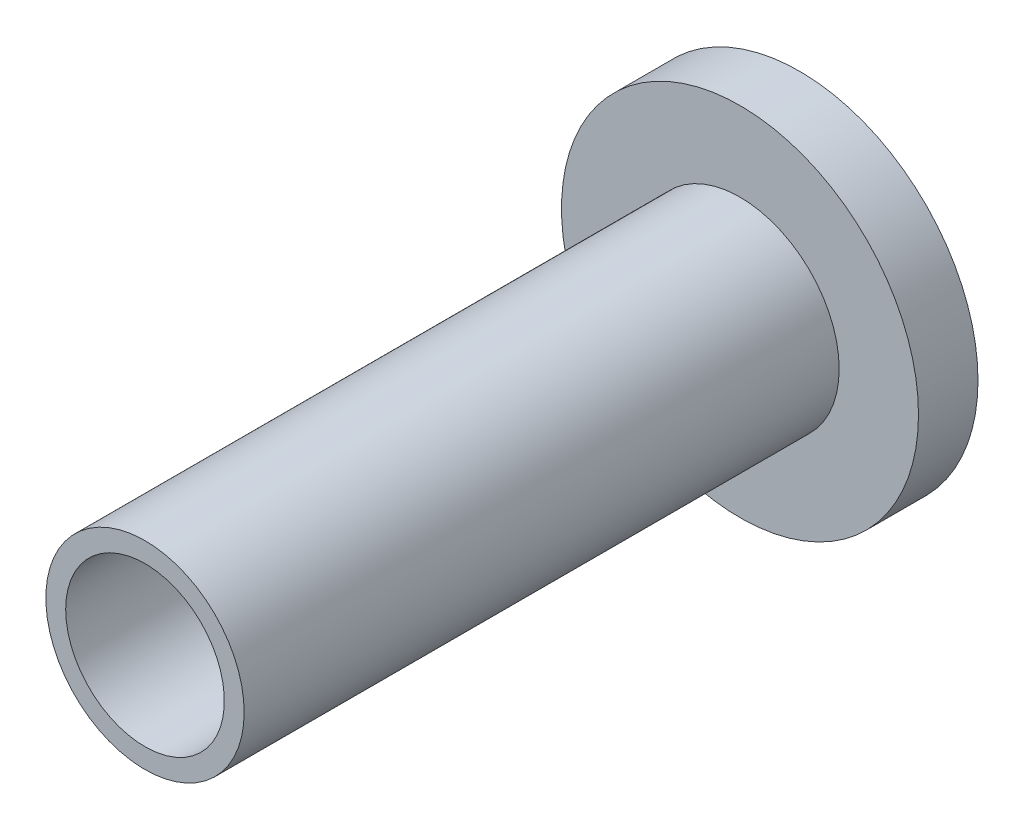
ISO-10303-21;
HEADER;
FILE_DESCRIPTION(('STEP AP214'),'2;1');
FILE_NAME('part.step','',(''),(''),'','','');
FILE_SCHEMA(('AUTOMOTIVE_DESIGN { 1 0 10303 214 1 1 1 1 }'));
ENDSEC;
DATA;
#1=APPLICATION_CONTEXT('core data for automotive mechanical design processes');
#2=APPLICATION_PROTOCOL_DEFINITION('international standard','automotive_design',2000,#1);
#3=PRODUCT_CONTEXT('',#1,'mechanical');
#4=PRODUCT('Part','Part','',(#3));
#5=PRODUCT_RELATED_PRODUCT_CATEGORY('part','',(#4));
#6=PRODUCT_DEFINITION_FORMATION('','',#4);
#7=PRODUCT_DEFINITION_CONTEXT('part definition',#1,'design');
#8=PRODUCT_DEFINITION('design','',#6,#7);
#9=PRODUCT_DEFINITION_SHAPE('','',#8);
#10=(LENGTH_UNIT() NAMED_UNIT(*) SI_UNIT(.MILLI.,.METRE.));
#11=(NAMED_UNIT(*) PLANE_ANGLE_UNIT() SI_UNIT($,.RADIAN.));
#12=(NAMED_UNIT(*) SI_UNIT($,.STERADIAN.) SOLID_ANGLE_UNIT());
#13=UNCERTAINTY_MEASURE_WITH_UNIT(LENGTH_MEASURE(1.E-05),#10,'distance_accuracy_value','');
#14=(GEOMETRIC_REPRESENTATION_CONTEXT(3) GLOBAL_UNCERTAINTY_ASSIGNED_CONTEXT((#13)) GLOBAL_UNIT_ASSIGNED_CONTEXT((#10,
#11,#12)) REPRESENTATION_CONTEXT('',''));
#15=CARTESIAN_POINT('',(0.,0.,0.));
#16=DIRECTION('',(0.,0.,1.));
#17=DIRECTION('',(1.,0.,0.));
#18=AXIS2_PLACEMENT_3D('',#15,#16,#17);
#19=CARTESIAN_POINT('',(0.,0.,15.));
#20=DIRECTION('',(0.,0.,-1.));
#21=DIRECTION('',(-1.,0.,0.));
#22=AXIS2_PLACEMENT_3D('',#19,#20,#21);
#23=CYLINDRICAL_SURFACE('',#22,2.5);
#24=CARTESIAN_POINT('',(0.,0.,15.));
#25=DIRECTION('',(0.,0.,1.));
#26=DIRECTION('',(1.,0.,0.));
#27=AXIS2_PLACEMENT_3D('',#24,#25,#26);
#28=CIRCLE('',#27,2.5);
#29=CARTESIAN_POINT('',(2.5,0.,15.));
#30=VERTEX_POINT('',#29);
#31=EDGE_CURVE('E11',#30,#30,#28,.T.);
#32=ORIENTED_EDGE('',*,*,#31,.F.);
#33=EDGE_LOOP('',(#32));
#34=FACE_BOUND('',#33,.T.);
#35=CARTESIAN_POINT('',(0.,0.,0.));
#36=DIRECTION('',(0.,0.,1.));
#37=DIRECTION('',(1.,0.,0.));
#38=AXIS2_PLACEMENT_3D('',#35,#36,#37);
#39=CIRCLE('',#38,2.5);
#40=CARTESIAN_POINT('',(2.5,0.,0.));
#41=VERTEX_POINT('',#40);
#42=EDGE_CURVE('E57',#41,#41,#39,.T.);
#43=ORIENTED_EDGE('',*,*,#42,.T.);
#44=EDGE_LOOP('',(#43));
#45=FACE_BOUND('',#44,.T.);
#46=ADVANCED_FACE('F49',(#34,#45),#23,.T.);
#47=CARTESIAN_POINT('',(0.,0.,15.));
#48=DIRECTION('',(0.,0.,1.));
#49=DIRECTION('',(1.,0.,0.));
#50=AXIS2_PLACEMENT_3D('',#47,#48,#49);
#51=PLANE('',#50);
#52=CARTESIAN_POINT('',(0.,0.,15.));
#53=DIRECTION('',(0.,0.,1.));
#54=DIRECTION('',(1.,0.,0.));
#55=AXIS2_PLACEMENT_3D('',#52,#53,#54);
#56=CIRCLE('',#55,2.);
#57=CARTESIAN_POINT('',(-2.,0.,15.));
#58=VERTEX_POINT('',#57);
#59=EDGE_CURVE('E52',#58,#58,#56,.F.);
#60=ORIENTED_EDGE('',*,*,#59,.T.);
#61=EDGE_LOOP('',(#60));
#62=FACE_BOUND('',#61,.T.);
#63=ORIENTED_EDGE('',*,*,#31,.T.);
#64=EDGE_LOOP('',(#63));
#65=FACE_BOUND('',#64,.T.);
#66=ADVANCED_FACE('F242',(#62,#65),#51,.T.);
#67=CARTESIAN_POINT('',(0.,0.,0.));
#68=DIRECTION('',(0.,0.,1.));
#69=DIRECTION('',(1.,0.,0.));
#70=AXIS2_PLACEMENT_3D('',#67,#68,#69);
#71=PLANE('',#70);
#72=CARTESIAN_POINT('',(0.,0.,0.));
#73=DIRECTION('',(0.,0.,1.));
#74=DIRECTION('',(1.,0.,0.));
#75=AXIS2_PLACEMENT_3D('',#72,#73,#74);
#76=CIRCLE('',#75,4.5);
#77=CARTESIAN_POINT('',(4.5,0.,0.));
#78=VERTEX_POINT('',#77);
#79=EDGE_CURVE('E159',#78,#78,#76,.T.);
#80=ORIENTED_EDGE('',*,*,#79,.T.);
#81=EDGE_LOOP('',(#80));
#82=FACE_BOUND('',#81,.T.);
#83=ORIENTED_EDGE('',*,*,#42,.F.);
#84=EDGE_LOOP('',(#83));
#85=FACE_BOUND('',#84,.T.);
#86=ADVANCED_FACE('F240',(#82,#85),#71,.T.);
#87=CARTESIAN_POINT('',(0.115769453402899,0.,-1.5));
#88=DIRECTION('',(1.,0.,0.));
#89=DIRECTION('',(0.,0.,-1.));
#90=AXIS2_PLACEMENT_3D('',#87,#88,#89);
#91=PLANE('',#90);
#92=DIRECTION('',(0.,1.,0.));
#93=VECTOR('',#92,1.);
#94=CARTESIAN_POINT('',(0.115769453402899,0.,0.));
#95=LINE('',#94,#93);
#96=CARTESIAN_POINT('',(0.115769453402899,-1.71873111590303,0.));
#97=VERTEX_POINT('',#96);
#98=CARTESIAN_POINT('',(0.115769453402899,-0.115769453402899,0.));
#99=VERTEX_POINT('',#98);
#100=EDGE_CURVE('E65',#97,#99,#95,.T.);
#101=ORIENTED_EDGE('',*,*,#100,.T.);
#102=DIRECTION('',(0.,0.,1.));
#103=VECTOR('',#102,1.);
#104=CARTESIAN_POINT('',(0.115769453402899,-0.115769453402899,-1.5));
#105=LINE('',#104,#103);
#106=CARTESIAN_POINT('',(0.115769453402899,-0.115769453402899,-1.5));
#107=VERTEX_POINT('',#106);
#108=EDGE_CURVE('E158',#107,#99,#105,.T.);
#109=ORIENTED_EDGE('',*,*,#108,.F.);
#110=DIRECTION('',(0.,1.,0.));
#111=VECTOR('',#110,1.);
#112=CARTESIAN_POINT('',(0.115769453402899,0.,-1.5));
#113=LINE('',#112,#111);
#114=CARTESIAN_POINT('',(0.115769453402899,-1.71873111590303,-1.5));
#115=VERTEX_POINT('',#114);
#116=EDGE_CURVE('E143',#115,#107,#113,.T.);
#117=ORIENTED_EDGE('',*,*,#116,.F.);
#118=DIRECTION('',(0.,0.,1.));
#119=VECTOR('',#118,1.);
#120=CARTESIAN_POINT('',(0.115769453402899,-1.71873111590303,-1.5));
#121=LINE('',#120,#119);
#122=EDGE_CURVE('E150',#115,#97,#121,.T.);
#123=ORIENTED_EDGE('',*,*,#122,.T.);
#124=EDGE_LOOP('',(#101,#109,#117,#123));
#125=FACE_BOUND('',#124,.T.);
#126=ADVANCED_FACE('F156',(#125),#91,.F.);
#127=CARTESIAN_POINT('',(0.,-0.115769453402899,-1.5));
#128=DIRECTION('',(0.,-1.,0.));
#129=DIRECTION('',(0.,0.,-1.));
#130=AXIS2_PLACEMENT_3D('',#127,#128,#129);
#131=PLANE('',#130);
#132=DIRECTION('',(1.,0.,0.));
#133=VECTOR('',#132,1.);
#134=CARTESIAN_POINT('',(0.,-0.115769453402899,0.));
#135=LINE('',#134,#133);
#136=CARTESIAN_POINT('',(1.71873111590303,-0.115769453402899,0.));
#137=VERTEX_POINT('',#136);
#138=EDGE_CURVE('E163',#99,#137,#135,.T.);
#139=ORIENTED_EDGE('',*,*,#138,.T.);
#140=DIRECTION('',(0.,0.,1.));
#141=VECTOR('',#140,1.);
#142=CARTESIAN_POINT('',(1.71873111590303,-0.115769453402899,-1.5));
#143=LINE('',#142,#141);
#144=CARTESIAN_POINT('',(1.71873111590303,-0.115769453402899,-1.5));
#145=VERTEX_POINT('',#144);
#146=EDGE_CURVE('E210',#145,#137,#143,.T.);
#147=ORIENTED_EDGE('',*,*,#146,.F.);
#148=DIRECTION('',(1.,0.,0.));
#149=VECTOR('',#148,1.);
#150=CARTESIAN_POINT('',(0.,-0.115769453402899,-1.5));
#151=LINE('',#150,#149);
#152=EDGE_CURVE('E187',#107,#145,#151,.T.);
#153=ORIENTED_EDGE('',*,*,#152,.F.);
#154=ORIENTED_EDGE('',*,*,#108,.T.);
#155=EDGE_LOOP('',(#139,#147,#153,#154));
#156=FACE_BOUND('',#155,.T.);
#157=ADVANCED_FACE('F249',(#156),#131,.F.);
#158=CARTESIAN_POINT('',(1.71873111590303,0.,-1.5));
#159=DIRECTION('',(-1.,0.,0.));
#160=DIRECTION('',(0.,0.,1.));
#161=AXIS2_PLACEMENT_3D('',#158,#159,#160);
#162=PLANE('',#161);
#163=DIRECTION('',(0.,-1.,0.));
#164=VECTOR('',#163,1.);
#165=CARTESIAN_POINT('',(1.71873111590303,0.,0.));
#166=LINE('',#165,#164);
#167=CARTESIAN_POINT('',(1.71873111590303,0.115769453402899,0.));
#168=VERTEX_POINT('',#167);
#169=EDGE_CURVE('E207',#168,#137,#166,.T.);
#170=ORIENTED_EDGE('',*,*,#169,.F.);
#171=DIRECTION('',(0.,0.,1.));
#172=VECTOR('',#171,1.);
#173=CARTESIAN_POINT('',(1.71873111590303,0.115769453402899,-1.5));
#174=LINE('',#173,#172);
#175=CARTESIAN_POINT('',(1.71873111590303,0.115769453402899,-1.5));
#176=VERTEX_POINT('',#175);
#177=EDGE_CURVE('E213',#176,#168,#174,.T.);
#178=ORIENTED_EDGE('',*,*,#177,.F.);
#179=DIRECTION('',(0.,-1.,0.));
#180=VECTOR('',#179,1.);
#181=CARTESIAN_POINT('',(1.71873111590303,0.,-1.5));
#182=LINE('',#181,#180);
#183=EDGE_CURVE('E173',#176,#145,#182,.T.);
#184=ORIENTED_EDGE('',*,*,#183,.T.);
#185=ORIENTED_EDGE('',*,*,#146,.T.);
#186=EDGE_LOOP('',(#170,#178,#184,#185));
#187=FACE_BOUND('',#186,.T.);
#188=ADVANCED_FACE('F298',(#187),#162,.T.);
#189=CARTESIAN_POINT('',(0.,0.115769453402899,-1.5));
#190=DIRECTION('',(0.,-1.,0.));
#191=DIRECTION('',(0.,0.,-1.));
#192=AXIS2_PLACEMENT_3D('',#189,#190,#191);
#193=PLANE('',#192);
#194=DIRECTION('',(1.,0.,0.));
#195=VECTOR('',#194,1.);
#196=CARTESIAN_POINT('',(0.,0.115769453402899,0.));
#197=LINE('',#196,#195);
#198=CARTESIAN_POINT('',(0.115769453402899,0.115769453402899,0.));
#199=VERTEX_POINT('',#198);
#200=EDGE_CURVE('E204',#199,#168,#197,.T.);
#201=ORIENTED_EDGE('',*,*,#200,.F.);
#202=DIRECTION('',(0.,0.,1.));
#203=VECTOR('',#202,1.);
#204=CARTESIAN_POINT('',(0.115769453402899,0.115769453402899,-1.5));
#205=LINE('',#204,#203);
#206=CARTESIAN_POINT('',(0.115769453402899,0.115769453402899,-1.5));
#207=VERTEX_POINT('',#206);
#208=EDGE_CURVE('E216',#207,#199,#205,.T.);
#209=ORIENTED_EDGE('',*,*,#208,.F.);
#210=DIRECTION('',(1.,0.,0.));
#211=VECTOR('',#210,1.);
#212=CARTESIAN_POINT('',(0.,0.115769453402899,-1.5));
#213=LINE('',#212,#211);
#214=EDGE_CURVE('E166',#207,#176,#213,.T.);
#215=ORIENTED_EDGE('',*,*,#214,.T.);
#216=ORIENTED_EDGE('',*,*,#177,.T.);
#217=EDGE_LOOP('',(#201,#209,#215,#216));
#218=FACE_BOUND('',#217,.T.);
#219=ADVANCED_FACE('F309',(#218),#193,.T.);
#220=CARTESIAN_POINT('',(0.115769453402899,1.71873111590303,0.));
#221=VERTEX_POINT('',#220);
#222=EDGE_CURVE('E191',#199,#221,#95,.T.);
#223=ORIENTED_EDGE('',*,*,#222,.T.);
#224=DIRECTION('',(0.,0.,1.));
#225=VECTOR('',#224,1.);
#226=CARTESIAN_POINT('',(0.115769453402899,1.71873111590303,-1.5));
#227=LINE('',#226,#225);
#228=CARTESIAN_POINT('',(0.115769453402899,1.71873111590303,-1.5));
#229=VERTEX_POINT('',#228);
#230=EDGE_CURVE('E219',#229,#221,#227,.T.);
#231=ORIENTED_EDGE('',*,*,#230,.F.);
#232=EDGE_CURVE('E161',#207,#229,#113,.T.);
#233=ORIENTED_EDGE('',*,*,#232,.F.);
#234=ORIENTED_EDGE('',*,*,#208,.T.);
#235=EDGE_LOOP('',(#223,#231,#233,#234));
#236=FACE_BOUND('',#235,.T.);
#237=ADVANCED_FACE('F251',(#236),#91,.F.);
#238=CARTESIAN_POINT('',(0.,1.71873111590303,-1.5));
#239=DIRECTION('',(0.,-1.,0.));
#240=DIRECTION('',(0.,0.,-1.));
#241=AXIS2_PLACEMENT_3D('',#238,#239,#240);
#242=PLANE('',#241);
#243=DIRECTION('',(1.,0.,0.));
#244=VECTOR('',#243,1.);
#245=CARTESIAN_POINT('',(0.,1.71873111590303,0.));
#246=LINE('',#245,#244);
#247=CARTESIAN_POINT('',(-0.115769453402899,1.71873111590303,0.));
#248=VERTEX_POINT('',#247);
#249=EDGE_CURVE('E205',#248,#221,#246,.T.);
#250=ORIENTED_EDGE('',*,*,#249,.F.);
#251=DIRECTION('',(0.,0.,1.));
#252=VECTOR('',#251,1.);
#253=CARTESIAN_POINT('',(-0.115769453402899,1.71873111590303,-1.5));
#254=LINE('',#253,#252);
#255=CARTESIAN_POINT('',(-0.115769453402899,1.71873111590303,-1.5));
#256=VERTEX_POINT('',#255);
#257=EDGE_CURVE('E221',#256,#248,#254,.T.);
#258=ORIENTED_EDGE('',*,*,#257,.F.);
#259=DIRECTION('',(1.,0.,0.));
#260=VECTOR('',#259,1.);
#261=CARTESIAN_POINT('',(0.,1.71873111590303,-1.5));
#262=LINE('',#261,#260);
#263=EDGE_CURVE('E167',#256,#229,#262,.T.);
#264=ORIENTED_EDGE('',*,*,#263,.T.);
#265=ORIENTED_EDGE('',*,*,#230,.T.);
#266=EDGE_LOOP('',(#250,#258,#264,#265));
#267=FACE_BOUND('',#266,.T.);
#268=ADVANCED_FACE('F329',(#267),#242,.T.);
#269=CARTESIAN_POINT('',(-0.115769453402899,0.,-1.5));
#270=DIRECTION('',(1.,0.,0.));
#271=DIRECTION('',(0.,0.,-1.));
#272=AXIS2_PLACEMENT_3D('',#269,#270,#271);
#273=PLANE('',#272);
#274=DIRECTION('',(0.,1.,0.));
#275=VECTOR('',#274,1.);
#276=CARTESIAN_POINT('',(-0.115769453402899,0.,0.));
#277=LINE('',#276,#275);
#278=CARTESIAN_POINT('',(-0.115769453402899,0.115769453402899,0.));
#279=VERTEX_POINT('',#278);
#280=EDGE_CURVE('E196',#279,#248,#277,.T.);
#281=ORIENTED_EDGE('',*,*,#280,.F.);
#282=DIRECTION('',(0.,0.,1.));
#283=VECTOR('',#282,1.);
#284=CARTESIAN_POINT('',(-0.115769453402899,0.115769453402899,-1.5));
#285=LINE('',#284,#283);
#286=CARTESIAN_POINT('',(-0.115769453402899,0.115769453402899,-1.5));
#287=VERTEX_POINT('',#286);
#288=EDGE_CURVE('E224',#287,#279,#285,.T.);
#289=ORIENTED_EDGE('',*,*,#288,.F.);
#290=DIRECTION('',(0.,1.,0.));
#291=VECTOR('',#290,1.);
#292=CARTESIAN_POINT('',(-0.115769453402899,0.,-1.5));
#293=LINE('',#292,#291);
#294=EDGE_CURVE('E177',#287,#256,#293,.T.);
#295=ORIENTED_EDGE('',*,*,#294,.T.);
#296=ORIENTED_EDGE('',*,*,#257,.T.);
#297=EDGE_LOOP('',(#281,#289,#295,#296));
#298=FACE_BOUND('',#297,.T.);
#299=ADVANCED_FACE('F338',(#298),#273,.T.);
#300=CARTESIAN_POINT('',(-1.71873111590303,0.115769453402899,0.));
#301=VERTEX_POINT('',#300);
#302=EDGE_CURVE('E202',#301,#279,#197,.T.);
#303=ORIENTED_EDGE('',*,*,#302,.F.);
#304=DIRECTION('',(0.,0.,1.));
#305=VECTOR('',#304,1.);
#306=CARTESIAN_POINT('',(-1.71873111590303,0.115769453402899,-1.5));
#307=LINE('',#306,#305);
#308=CARTESIAN_POINT('',(-1.71873111590303,0.115769453402899,-1.5));
#309=VERTEX_POINT('',#308);
#310=EDGE_CURVE('E227',#309,#301,#307,.T.);
#311=ORIENTED_EDGE('',*,*,#310,.F.);
#312=EDGE_CURVE('E175',#309,#287,#213,.T.);
#313=ORIENTED_EDGE('',*,*,#312,.T.);
#314=ORIENTED_EDGE('',*,*,#288,.T.);
#315=EDGE_LOOP('',(#303,#311,#313,#314));
#316=FACE_BOUND('',#315,.T.);
#317=ADVANCED_FACE('F321',(#316),#193,.T.);
#318=CARTESIAN_POINT('',(-1.71873111590303,0.,-1.5));
#319=DIRECTION('',(-1.,0.,0.));
#320=DIRECTION('',(0.,0.,1.));
#321=AXIS2_PLACEMENT_3D('',#318,#319,#320);
#322=PLANE('',#321);
#323=DIRECTION('',(0.,-1.,0.));
#324=VECTOR('',#323,1.);
#325=CARTESIAN_POINT('',(-1.71873111590303,0.,0.));
#326=LINE('',#325,#324);
#327=CARTESIAN_POINT('',(-1.71873111590303,-0.115769453402899,0.));
#328=VERTEX_POINT('',#327);
#329=EDGE_CURVE('E199',#301,#328,#326,.T.);
#330=ORIENTED_EDGE('',*,*,#329,.T.);
#331=DIRECTION('',(0.,0.,1.));
#332=VECTOR('',#331,1.);
#333=CARTESIAN_POINT('',(-1.71873111590303,-0.115769453402899,-1.5));
#334=LINE('',#333,#332);
#335=CARTESIAN_POINT('',(-1.71873111590303,-0.115769453402899,-1.5));
#336=VERTEX_POINT('',#335);
#337=EDGE_CURVE('E230',#336,#328,#334,.T.);
#338=ORIENTED_EDGE('',*,*,#337,.F.);
#339=DIRECTION('',(0.,-1.,0.));
#340=VECTOR('',#339,1.);
#341=CARTESIAN_POINT('',(-1.71873111590303,0.,-1.5));
#342=LINE('',#341,#340);
#343=EDGE_CURVE('E453',#309,#336,#342,.T.);
#344=ORIENTED_EDGE('',*,*,#343,.F.);
#345=ORIENTED_EDGE('',*,*,#310,.T.);
#346=EDGE_LOOP('',(#330,#338,#344,#345));
#347=FACE_BOUND('',#346,.T.);
#348=ADVANCED_FACE('F357',(#347),#322,.F.);
#349=CARTESIAN_POINT('',(-0.115769453402899,-0.115769453402899,0.));
#350=VERTEX_POINT('',#349);
#351=EDGE_CURVE('E195',#328,#350,#135,.T.);
#352=ORIENTED_EDGE('',*,*,#351,.T.);
#353=DIRECTION('',(0.,0.,1.));
#354=VECTOR('',#353,1.);
#355=CARTESIAN_POINT('',(-0.115769453402899,-0.115769453402899,-1.5));
#356=LINE('',#355,#354);
#357=CARTESIAN_POINT('',(-0.115769453402899,-0.115769453402899,-1.5));
#358=VERTEX_POINT('',#357);
#359=EDGE_CURVE('E233',#358,#350,#356,.T.);
#360=ORIENTED_EDGE('',*,*,#359,.F.);
#361=EDGE_CURVE('E452',#336,#358,#151,.T.);
#362=ORIENTED_EDGE('',*,*,#361,.F.);
#363=ORIENTED_EDGE('',*,*,#337,.T.);
#364=EDGE_LOOP('',(#352,#360,#362,#363));
#365=FACE_BOUND('',#364,.T.);
#366=ADVANCED_FACE('F301',(#365),#131,.F.);
#367=CARTESIAN_POINT('',(-0.115769453402899,-1.71873111590303,0.));
#368=VERTEX_POINT('',#367);
#369=EDGE_CURVE('E193',#368,#350,#277,.T.);
#370=ORIENTED_EDGE('',*,*,#369,.F.);
#371=DIRECTION('',(0.,0.,1.));
#372=VECTOR('',#371,1.);
#373=CARTESIAN_POINT('',(-0.115769453402899,-1.71873111590303,-1.5));
#374=LINE('',#373,#372);
#375=CARTESIAN_POINT('',(-0.115769453402899,-1.71873111590303,-1.5));
#376=VERTEX_POINT('',#375);
#377=EDGE_CURVE('E153',#376,#368,#374,.T.);
#378=ORIENTED_EDGE('',*,*,#377,.F.);
#379=EDGE_CURVE('E146',#376,#358,#293,.T.);
#380=ORIENTED_EDGE('',*,*,#379,.T.);
#381=ORIENTED_EDGE('',*,*,#359,.T.);
#382=EDGE_LOOP('',(#370,#378,#380,#381));
#383=FACE_BOUND('',#382,.T.);
#384=ADVANCED_FACE('F349',(#383),#273,.T.);
#385=CARTESIAN_POINT('',(0.,-1.71873111590303,-1.5));
#386=DIRECTION('',(0.,-1.,0.));
#387=DIRECTION('',(0.,0.,-1.));
#388=AXIS2_PLACEMENT_3D('',#385,#386,#387);
#389=PLANE('',#388);
#390=DIRECTION('',(1.,0.,0.));
#391=VECTOR('',#390,1.);
#392=CARTESIAN_POINT('',(0.,-1.71873111590303,0.));
#393=LINE('',#392,#391);
#394=EDGE_CURVE('E69',#368,#97,#393,.T.);
#395=ORIENTED_EDGE('',*,*,#394,.T.);
#396=ORIENTED_EDGE('',*,*,#122,.F.);
#397=DIRECTION('',(1.,0.,0.));
#398=VECTOR('',#397,1.);
#399=CARTESIAN_POINT('',(0.,-1.71873111590303,-1.5));
#400=LINE('',#399,#398);
#401=EDGE_CURVE('E138',#376,#115,#400,.T.);
#402=ORIENTED_EDGE('',*,*,#401,.F.);
#403=ORIENTED_EDGE('',*,*,#377,.T.);
#404=EDGE_LOOP('',(#395,#396,#402,#403));
#405=FACE_BOUND('',#404,.T.);
#406=ADVANCED_FACE('F151',(#405),#389,.F.);
#407=CARTESIAN_POINT('',(0.,0.,-1.5));
#408=DIRECTION('',(0.,0.,1.));
#409=DIRECTION('',(1.,0.,0.));
#410=AXIS2_PLACEMENT_3D('',#407,#408,#409);
#411=CYLINDRICAL_SURFACE('',#410,4.5);
#412=CARTESIAN_POINT('',(0.,0.,-1.5));
#413=DIRECTION('',(0.,0.,1.));
#414=DIRECTION('',(1.,0.,0.));
#415=AXIS2_PLACEMENT_3D('',#412,#413,#414);
#416=CIRCLE('',#415,4.5);
#417=CARTESIAN_POINT('',(4.5,0.,-1.5));
#418=VERTEX_POINT('',#417);
#419=EDGE_CURVE('E154',#418,#418,#416,.T.);
#420=ORIENTED_EDGE('',*,*,#419,.T.);
#421=EDGE_LOOP('',(#420));
#422=FACE_BOUND('',#421,.T.);
#423=ORIENTED_EDGE('',*,*,#79,.F.);
#424=EDGE_LOOP('',(#423));
#425=FACE_BOUND('',#424,.T.);
#426=ADVANCED_FACE('F391',(#422,#425),#411,.T.);
#427=CARTESIAN_POINT('',(0.,0.,-1.5));
#428=DIRECTION('',(0.,0.,1.));
#429=DIRECTION('',(1.,0.,0.));
#430=AXIS2_PLACEMENT_3D('',#427,#428,#429);
#431=PLANE('',#430);
#432=ORIENTED_EDGE('',*,*,#116,.T.);
#433=ORIENTED_EDGE('',*,*,#152,.T.);
#434=ORIENTED_EDGE('',*,*,#183,.F.);
#435=ORIENTED_EDGE('',*,*,#214,.F.);
#436=ORIENTED_EDGE('',*,*,#232,.T.);
#437=ORIENTED_EDGE('',*,*,#263,.F.);
#438=ORIENTED_EDGE('',*,*,#294,.F.);
#439=ORIENTED_EDGE('',*,*,#312,.F.);
#440=ORIENTED_EDGE('',*,*,#343,.T.);
#441=ORIENTED_EDGE('',*,*,#361,.T.);
#442=ORIENTED_EDGE('',*,*,#379,.F.);
#443=ORIENTED_EDGE('',*,*,#401,.T.);
#444=EDGE_LOOP('',(#432,#433,#434,#435,#436,#437,#438,#439,#440,#441,#442,#443));
#445=FACE_BOUND('',#444,.T.);
#446=ORIENTED_EDGE('',*,*,#419,.F.);
#447=EDGE_LOOP('',(#446));
#448=FACE_BOUND('',#447,.T.);
#449=ADVANCED_FACE('F140',(#445,#448),#431,.F.);
#450=CARTESIAN_POINT('',(0.,0.,0.));
#451=DIRECTION('',(0.,0.,1.));
#452=DIRECTION('',(1.,0.,0.));
#453=AXIS2_PLACEMENT_3D('',#450,#451,#452);
#454=PLANE('',#453);
#455=ORIENTED_EDGE('',*,*,#100,.F.);
#456=ORIENTED_EDGE('',*,*,#394,.F.);
#457=ORIENTED_EDGE('',*,*,#369,.T.);
#458=ORIENTED_EDGE('',*,*,#351,.F.);
#459=ORIENTED_EDGE('',*,*,#329,.F.);
#460=ORIENTED_EDGE('',*,*,#302,.T.);
#461=ORIENTED_EDGE('',*,*,#280,.T.);
#462=ORIENTED_EDGE('',*,*,#249,.T.);
#463=ORIENTED_EDGE('',*,*,#222,.F.);
#464=ORIENTED_EDGE('',*,*,#200,.T.);
#465=ORIENTED_EDGE('',*,*,#169,.T.);
#466=ORIENTED_EDGE('',*,*,#138,.F.);
#467=EDGE_LOOP('',(#455,#456,#457,#458,#459,#460,#461,#462,#463,#464,#465,#466));
#468=FACE_BOUND('',#467,.T.);
#469=ADVANCED_FACE('F277',(#468),#454,.F.);
#470=CARTESIAN_POINT('',(0.,0.,15.000012));
#471=DIRECTION('',(0.,0.,-1.));
#472=DIRECTION('',(-1.,0.,0.));
#473=AXIS2_PLACEMENT_3D('',#470,#471,#472);
#474=CYLINDRICAL_SURFACE('',#473,2.);
#475=CARTESIAN_POINT('',(0.,0.,5.));
#476=DIRECTION('',(0.,0.,1.));
#477=DIRECTION('',(1.,0.,0.));
#478=AXIS2_PLACEMENT_3D('',#475,#476,#477);
#479=CIRCLE('',#478,2.);
#480=CARTESIAN_POINT('',(-2.,0.,5.));
#481=VERTEX_POINT('',#480);
#482=EDGE_CURVE('E431',#481,#481,#479,.T.);
#483=CARTESIAN_POINT('',(-2.,0.,15.));
#484=CARTESIAN_POINT('',(-2.,0.,14.8958333333333));
#485=CARTESIAN_POINT('',(-2.,0.,14.7916666666667));
#486=CARTESIAN_POINT('',(-2.,0.,14.5833333333333));
#487=CARTESIAN_POINT('',(-2.,0.,14.4791666666667));
#488=CARTESIAN_POINT('',(-2.,0.,14.2708333333333));
#489=CARTESIAN_POINT('',(-2.,0.,14.1666666666667));
#490=CARTESIAN_POINT('',(-2.,0.,13.9583333333333));
#491=CARTESIAN_POINT('',(-2.,0.,13.8541666666667));
#492=CARTESIAN_POINT('',(-2.,0.,13.6458333333333));
#493=CARTESIAN_POINT('',(-2.,0.,13.5416666666667));
#494=CARTESIAN_POINT('',(-2.,0.,13.3333333333333));
#495=CARTESIAN_POINT('',(-2.,0.,13.2291666666667));
#496=CARTESIAN_POINT('',(-2.,0.,13.0208333333333));
#497=CARTESIAN_POINT('',(-2.,0.,12.9166666666667));
#498=CARTESIAN_POINT('',(-2.,0.,12.7083333333333));
#499=CARTESIAN_POINT('',(-2.,0.,12.6041666666667));
#500=CARTESIAN_POINT('',(-2.,0.,12.3958333333333));
#501=CARTESIAN_POINT('',(-2.,0.,12.2916666666667));
#502=CARTESIAN_POINT('',(-2.,0.,12.0833333333333));
#503=CARTESIAN_POINT('',(-2.,0.,11.9791666666667));
#504=CARTESIAN_POINT('',(-2.,0.,11.7708333333333));
#505=CARTESIAN_POINT('',(-2.,0.,11.6666666666667));
#506=CARTESIAN_POINT('',(-2.,0.,11.4583333333333));
#507=CARTESIAN_POINT('',(-2.,0.,11.3541666666667));
#508=CARTESIAN_POINT('',(-2.,0.,11.1458333333333));
#509=CARTESIAN_POINT('',(-2.,0.,11.0416666666667));
#510=CARTESIAN_POINT('',(-2.,0.,10.8333333333333));
#511=CARTESIAN_POINT('',(-2.,0.,10.7291666666667));
#512=CARTESIAN_POINT('',(-2.,0.,10.5208333333333));
#513=CARTESIAN_POINT('',(-2.,0.,10.4166666666667));
#514=CARTESIAN_POINT('',(-2.,0.,10.2083333333333));
#515=CARTESIAN_POINT('',(-2.,0.,10.1041666666667));
#516=CARTESIAN_POINT('',(-2.,0.,9.89583333333333));
#517=CARTESIAN_POINT('',(-2.,0.,9.79166666666667));
#518=CARTESIAN_POINT('',(-2.,0.,9.58333333333333));
#519=CARTESIAN_POINT('',(-2.,0.,9.47916666666667));
#520=CARTESIAN_POINT('',(-2.,0.,9.27083333333333));
#521=CARTESIAN_POINT('',(-2.,0.,9.16666666666667));
#522=CARTESIAN_POINT('',(-2.,0.,8.95833333333333));
#523=CARTESIAN_POINT('',(-2.,0.,8.85416666666667));
#524=CARTESIAN_POINT('',(-2.,0.,8.64583333333333));
#525=CARTESIAN_POINT('',(-2.,0.,8.54166666666667));
#526=CARTESIAN_POINT('',(-2.,0.,8.33333333333333));
#527=CARTESIAN_POINT('',(-2.,0.,8.22916666666667));
#528=CARTESIAN_POINT('',(-2.,0.,8.02083333333333));
#529=CARTESIAN_POINT('',(-2.,0.,7.91666666666667));
#530=CARTESIAN_POINT('',(-2.,0.,7.70833333333333));
#531=CARTESIAN_POINT('',(-2.,0.,7.60416666666667));
#532=CARTESIAN_POINT('',(-2.,0.,7.39583333333333));
#533=CARTESIAN_POINT('',(-2.,0.,7.29166666666667));
#534=CARTESIAN_POINT('',(-2.,0.,7.08333333333333));
#535=CARTESIAN_POINT('',(-2.,0.,6.97916666666667));
#536=CARTESIAN_POINT('',(-2.,0.,6.77083333333333));
#537=CARTESIAN_POINT('',(-2.,0.,6.66666666666667));
#538=CARTESIAN_POINT('',(-2.,0.,6.45833333333333));
#539=CARTESIAN_POINT('',(-2.,0.,6.35416666666667));
#540=CARTESIAN_POINT('',(-2.,0.,6.14583333333333));
#541=CARTESIAN_POINT('',(-2.,0.,6.04166666666667));
#542=CARTESIAN_POINT('',(-2.,0.,5.83333333333333));
#543=CARTESIAN_POINT('',(-2.,0.,5.72916666666667));
#544=CARTESIAN_POINT('',(-2.,0.,5.52083333333333));
#545=CARTESIAN_POINT('',(-2.,0.,5.41666666666667));
#546=CARTESIAN_POINT('',(-2.,0.,5.20833333333333));
#547=CARTESIAN_POINT('',(-2.,0.,5.10416666666667));
#548=CARTESIAN_POINT('',(-2.,0.,5.));
#549=B_SPLINE_CURVE_WITH_KNOTS('',3,(#483,#484,#485,#486,#487,#488,#489,#490,#491,#492,#493,
#494,#495,#496,#497,#498,#499,#500,#501,#502,#503,#504,#505,#506,#507,#508,#509,#510,#511,#512,
#513,#514,#515,#516,#517,#518,#519,#520,#521,#522,#523,#524,#525,#526,#527,#528,#529,#530,#531,
#532,#533,#534,#535,#536,#537,#538,#539,#540,#541,#542,#543,#544,#545,#546,#547,#548),
.UNSPECIFIED.,.F.,.F.,(4,2,2,2,2,2,2,2,2,2,2,2,2,2,2,2,2,2,2,2,2,2,2,2,2,2,2,2,2,2,2,2,4),(0.,
0.312499999999999,0.624999999999999,0.937499999999999,1.25,1.5625,1.875,2.1875,2.5,2.8125,3.125,
3.4375,3.75,4.0625,4.375,4.6875,5.,5.3125,5.625,5.9375,6.25,6.5625,6.875,7.1875,7.5,7.8125,
8.125,8.4375,8.75,9.0625,9.375,9.6875,10.),.UNSPECIFIED.);
#550=EDGE_CURVE('BSEAM280',#58,#481,#549,.T.);
#551=ORIENTED_EDGE('',*,*,#59,.F.);
#552=ORIENTED_EDGE('',*,*,#482,.F.);
#553=ORIENTED_EDGE('',*,*,#550,.T.);
#554=ORIENTED_EDGE('',*,*,#550,.F.);
#555=EDGE_LOOP('',(#551,#553,#552,#554));
#556=FACE_BOUND('',#555,.T.);
#557=ADVANCED_FACE('F280',(#556),#474,.F.);
#558=CARTESIAN_POINT('',(0.,0.,5.));
#559=DIRECTION('',(0.,0.,1.));
#560=DIRECTION('',(1.,0.,0.));
#561=AXIS2_PLACEMENT_3D('',#558,#559,#560);
#562=PLANE('',#561);
#563=ORIENTED_EDGE('',*,*,#482,.T.);
#564=EDGE_LOOP('',(#563));
#565=FACE_BOUND('',#564,.T.);
#566=ADVANCED_FACE('F415',(#565),#562,.T.);
#567=CLOSED_SHELL('',(#46,#66,#86,#126,#157,#188,#219,#237,#268,#299,#317,#348,#366,#384,#406,
#426,#449,#469,#557,#566));
#568=MANIFOLD_SOLID_BREP('B2',#567);
#569=ADVANCED_BREP_SHAPE_REPRESENTATION('',(#18,#568),#14);
#570=SHAPE_DEFINITION_REPRESENTATION(#9,#569);
ENDSEC;
END-ISO-10303-21;
